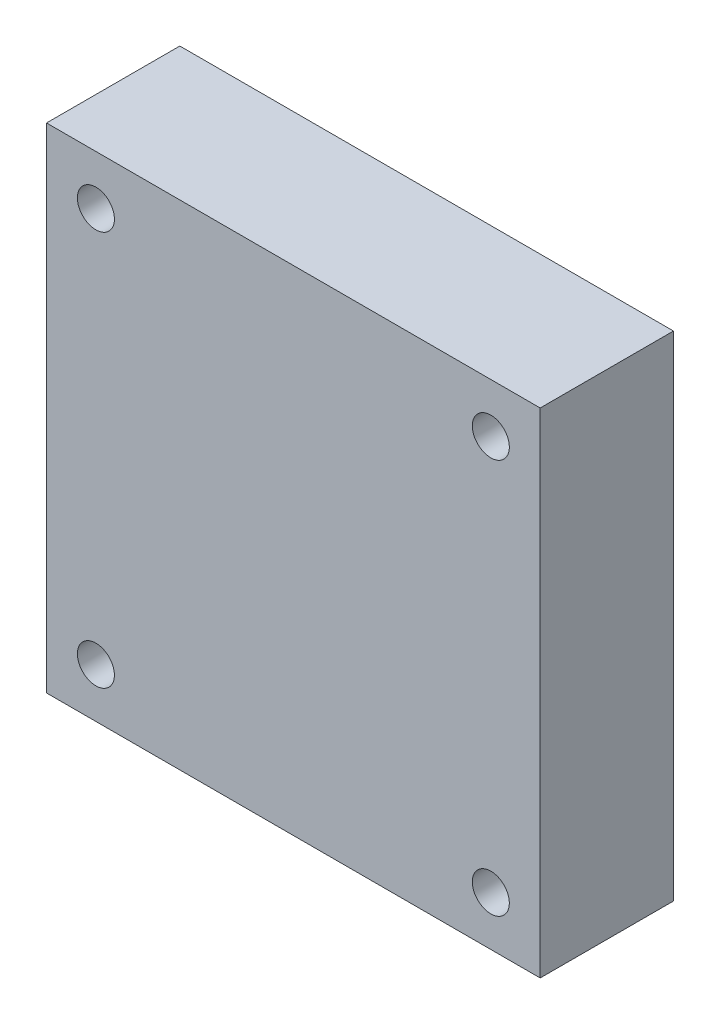
ISO-10303-21;
HEADER;
FILE_DESCRIPTION(('STEP AP214'),'2;1');
FILE_NAME('part.step','',(''),(''),'','','');
FILE_SCHEMA(('AUTOMOTIVE_DESIGN { 1 0 10303 214 1 1 1 1 }'));
ENDSEC;
DATA;
#1=APPLICATION_CONTEXT('core data for automotive mechanical design processes');
#2=APPLICATION_PROTOCOL_DEFINITION('international standard','automotive_design',2000,#1);
#3=PRODUCT_CONTEXT('',#1,'mechanical');
#4=PRODUCT('Part','Part','',(#3));
#5=PRODUCT_RELATED_PRODUCT_CATEGORY('part','',(#4));
#6=PRODUCT_DEFINITION_FORMATION('','',#4);
#7=PRODUCT_DEFINITION_CONTEXT('part definition',#1,'design');
#8=PRODUCT_DEFINITION('design','',#6,#7);
#9=PRODUCT_DEFINITION_SHAPE('','',#8);
#10=(LENGTH_UNIT() NAMED_UNIT(*) SI_UNIT(.MILLI.,.METRE.));
#11=(NAMED_UNIT(*) PLANE_ANGLE_UNIT() SI_UNIT($,.RADIAN.));
#12=(NAMED_UNIT(*) SI_UNIT($,.STERADIAN.) SOLID_ANGLE_UNIT());
#13=UNCERTAINTY_MEASURE_WITH_UNIT(LENGTH_MEASURE(1.E-05),#10,'distance_accuracy_value','');
#14=(GEOMETRIC_REPRESENTATION_CONTEXT(3) GLOBAL_UNCERTAINTY_ASSIGNED_CONTEXT((#13)) GLOBAL_UNIT_ASSIGNED_CONTEXT((#10,
#11,#12)) REPRESENTATION_CONTEXT('',''));
#15=CARTESIAN_POINT('',(0.,0.,0.));
#16=DIRECTION('',(0.,0.,1.));
#17=DIRECTION('',(1.,0.,0.));
#18=AXIS2_PLACEMENT_3D('',#15,#16,#17);
#19=CARTESIAN_POINT('',(0.,0.,-24.9999999999825));
#20=DIRECTION('',(0.,0.,-1.));
#21=DIRECTION('',(-1.,0.,0.));
#22=AXIS2_PLACEMENT_3D('',#19,#20,#21);
#23=PLANE('',#22);
#24=CARTESIAN_POINT('',(-43.5,-43.5,-24.9999999999825));
#25=DIRECTION('',(0.,0.,-1.));
#26=DIRECTION('',(-1.,0.,0.));
#27=AXIS2_PLACEMENT_3D('',#24,#25,#26);
#28=CIRCLE('',#27,1.5);
#29=CARTESIAN_POINT('',(-45.,-43.5,-24.9999999999825));
#30=VERTEX_POINT('',#29);
#31=EDGE_CURVE('E111',#30,#30,#28,.T.);
#32=ORIENTED_EDGE('',*,*,#31,.F.);
#33=EDGE_LOOP('',(#32));
#34=FACE_BOUND('',#33,.T.);
#35=CARTESIAN_POINT('',(-11.5,-11.5,-24.9999999999825));
#36=DIRECTION('',(0.,0.,-1.));
#37=DIRECTION('',(-1.,0.,0.));
#38=AXIS2_PLACEMENT_3D('',#35,#36,#37);
#39=CIRCLE('',#38,1.5);
#40=CARTESIAN_POINT('',(-13.,-11.5,-24.9999999999825));
#41=VERTEX_POINT('',#40);
#42=EDGE_CURVE('E284',#41,#41,#39,.T.);
#43=ORIENTED_EDGE('',*,*,#42,.F.);
#44=EDGE_LOOP('',(#43));
#45=FACE_BOUND('',#44,.T.);
#46=CARTESIAN_POINT('',(-11.5,-43.5,-24.9999999999825));
#47=DIRECTION('',(0.,0.,-1.));
#48=DIRECTION('',(-1.,0.,0.));
#49=AXIS2_PLACEMENT_3D('',#46,#47,#48);
#50=CIRCLE('',#49,1.5);
#51=CARTESIAN_POINT('',(-13.,-43.5,-24.9999999999825));
#52=VERTEX_POINT('',#51);
#53=EDGE_CURVE('E288',#52,#52,#50,.T.);
#54=ORIENTED_EDGE('',*,*,#53,.F.);
#55=EDGE_LOOP('',(#54));
#56=FACE_BOUND('',#55,.T.);
#57=CARTESIAN_POINT('',(-43.5,-11.5,-24.9999999999825));
#58=DIRECTION('',(0.,0.,-1.));
#59=DIRECTION('',(-1.,0.,0.));
#60=AXIS2_PLACEMENT_3D('',#57,#58,#59);
#61=CIRCLE('',#60,1.5);
#62=CARTESIAN_POINT('',(-45.,-11.5,-24.9999999999825));
#63=VERTEX_POINT('',#62);
#64=EDGE_CURVE('E291',#63,#63,#61,.T.);
#65=ORIENTED_EDGE('',*,*,#64,.F.);
#66=EDGE_LOOP('',(#65));
#67=FACE_BOUND('',#66,.T.);
#68=DIRECTION('',(1.,0.,0.));
#69=VECTOR('',#68,1.);
#70=CARTESIAN_POINT('',(-47.5,-7.50000000000001,-24.9999999999825));
#71=LINE('',#70,#69);
#72=CARTESIAN_POINT('',(-47.5,-7.50000000000001,-24.9999999999825));
#73=VERTEX_POINT('',#72);
#74=CARTESIAN_POINT('',(-7.5,-7.50000000000001,-24.9999999999825));
#75=VERTEX_POINT('',#74);
#76=EDGE_CURVE('E119',#73,#75,#71,.T.);
#77=ORIENTED_EDGE('',*,*,#76,.T.);
#78=DIRECTION('',(0.,-1.,0.));
#79=VECTOR('',#78,1.);
#80=CARTESIAN_POINT('',(-7.5,-7.50000000000001,-24.9999999999825));
#81=LINE('',#80,#79);
#82=CARTESIAN_POINT('',(-7.5,-47.5,-24.9999999999825));
#83=VERTEX_POINT('',#82);
#84=EDGE_CURVE('E117',#75,#83,#81,.T.);
#85=ORIENTED_EDGE('',*,*,#84,.T.);
#86=DIRECTION('',(1.,0.,0.));
#87=VECTOR('',#86,1.);
#88=CARTESIAN_POINT('',(-47.5,-47.5,-24.9999999999825));
#89=LINE('',#88,#87);
#90=CARTESIAN_POINT('',(-47.5,-47.5,-24.9999999999825));
#91=VERTEX_POINT('',#90);
#92=EDGE_CURVE('E51',#91,#83,#89,.T.);
#93=ORIENTED_EDGE('',*,*,#92,.F.);
#94=DIRECTION('',(0.,-1.,0.));
#95=VECTOR('',#94,1.);
#96=CARTESIAN_POINT('',(-47.5,-7.50000000000001,-24.9999999999825));
#97=LINE('',#96,#95);
#98=EDGE_CURVE('E12',#73,#91,#97,.T.);
#99=ORIENTED_EDGE('',*,*,#98,.F.);
#100=EDGE_LOOP('',(#77,#85,#93,#99));
#101=FACE_BOUND('',#100,.T.);
#102=ADVANCED_FACE('F41',(#34,#45,#56,#67,#101),#23,.T.);
#103=CARTESIAN_POINT('',(0.,0.,-14.1999999999825));
#104=DIRECTION('',(0.,0.,1.));
#105=DIRECTION('',(1.,0.,0.));
#106=AXIS2_PLACEMENT_3D('',#103,#104,#105);
#107=PLANE('',#106);
#108=CARTESIAN_POINT('',(-43.5,-43.5,-14.1999999999825));
#109=DIRECTION('',(0.,0.,1.));
#110=DIRECTION('',(-1.,0.,0.));
#111=AXIS2_PLACEMENT_3D('',#108,#109,#110);
#112=CIRCLE('',#111,1.5);
#113=CARTESIAN_POINT('',(-45.,-43.5,-14.1999999999825));
#114=VERTEX_POINT('',#113);
#115=EDGE_CURVE('E296',#114,#114,#112,.T.);
#116=ORIENTED_EDGE('',*,*,#115,.F.);
#117=EDGE_LOOP('',(#116));
#118=FACE_BOUND('',#117,.T.);
#119=CARTESIAN_POINT('',(-11.5,-11.5,-14.1999999999825));
#120=DIRECTION('',(0.,0.,1.));
#121=DIRECTION('',(-1.,0.,0.));
#122=AXIS2_PLACEMENT_3D('',#119,#120,#121);
#123=CIRCLE('',#122,1.5);
#124=CARTESIAN_POINT('',(-13.,-11.5,-14.1999999999825));
#125=VERTEX_POINT('',#124);
#126=EDGE_CURVE('E309',#125,#125,#123,.T.);
#127=ORIENTED_EDGE('',*,*,#126,.F.);
#128=EDGE_LOOP('',(#127));
#129=FACE_BOUND('',#128,.T.);
#130=CARTESIAN_POINT('',(-11.5,-43.5,-14.1999999999825));
#131=DIRECTION('',(0.,0.,1.));
#132=DIRECTION('',(1.,0.,0.));
#133=AXIS2_PLACEMENT_3D('',#130,#131,#132);
#134=CIRCLE('',#133,1.5);
#135=CARTESIAN_POINT('',(-9.99999999999998,-43.5,-14.1999999999825));
#136=VERTEX_POINT('',#135);
#137=EDGE_CURVE('E312',#136,#136,#134,.T.);
#138=ORIENTED_EDGE('',*,*,#137,.F.);
#139=EDGE_LOOP('',(#138));
#140=FACE_BOUND('',#139,.T.);
#141=CARTESIAN_POINT('',(-43.5,-11.5,-14.1999999999825));
#142=DIRECTION('',(0.,0.,1.));
#143=DIRECTION('',(1.,0.,0.));
#144=AXIS2_PLACEMENT_3D('',#141,#142,#143);
#145=CIRCLE('',#144,1.5);
#146=CARTESIAN_POINT('',(-42.,-11.5,-14.1999999999825));
#147=VERTEX_POINT('',#146);
#148=EDGE_CURVE('E292',#147,#147,#145,.T.);
#149=ORIENTED_EDGE('',*,*,#148,.F.);
#150=EDGE_LOOP('',(#149));
#151=FACE_BOUND('',#150,.T.);
#152=DIRECTION('',(-1.,0.,0.));
#153=VECTOR('',#152,1.);
#154=CARTESIAN_POINT('',(-7.49999999999999,-7.50000000000001,-14.1999999999825));
#155=LINE('',#154,#153);
#156=CARTESIAN_POINT('',(-7.49999999999999,-7.50000000000001,-14.1999999999825));
#157=VERTEX_POINT('',#156);
#158=CARTESIAN_POINT('',(-47.5,-7.50000000000001,-14.1999999999825));
#159=VERTEX_POINT('',#158);
#160=EDGE_CURVE('E91',#157,#159,#155,.T.);
#161=ORIENTED_EDGE('',*,*,#160,.T.);
#162=DIRECTION('',(0.,-1.,0.));
#163=VECTOR('',#162,1.);
#164=CARTESIAN_POINT('',(-47.5,-7.50000000000001,-14.1999999999825));
#165=LINE('',#164,#163);
#166=CARTESIAN_POINT('',(-47.5,-47.5,-14.1999999999825));
#167=VERTEX_POINT('',#166);
#168=EDGE_CURVE('E110',#159,#167,#165,.T.);
#169=ORIENTED_EDGE('',*,*,#168,.T.);
#170=DIRECTION('',(-1.,0.,0.));
#171=VECTOR('',#170,1.);
#172=CARTESIAN_POINT('',(-7.49999999999999,-47.5,-14.1999999999825));
#173=LINE('',#172,#171);
#174=CARTESIAN_POINT('',(-7.49999999999999,-47.5,-14.1999999999825));
#175=VERTEX_POINT('',#174);
#176=EDGE_CURVE('E93',#175,#167,#173,.T.);
#177=ORIENTED_EDGE('',*,*,#176,.F.);
#178=DIRECTION('',(0.,-1.,0.));
#179=VECTOR('',#178,1.);
#180=CARTESIAN_POINT('',(-7.49999999999999,-7.50000000000001,-14.1999999999825));
#181=LINE('',#180,#179);
#182=EDGE_CURVE('E86',#157,#175,#181,.T.);
#183=ORIENTED_EDGE('',*,*,#182,.F.);
#184=EDGE_LOOP('',(#161,#169,#177,#183));
#185=FACE_BOUND('',#184,.T.);
#186=ADVANCED_FACE('F89',(#118,#129,#140,#151,#185),#107,.T.);
#187=CARTESIAN_POINT('',(0.,-47.5,0.));
#188=DIRECTION('',(0.,-1.,0.));
#189=DIRECTION('',(0.,0.,-1.));
#190=AXIS2_PLACEMENT_3D('',#187,#188,#189);
#191=PLANE('',#190);
#192=DIRECTION('',(0.,0.,-1.));
#193=VECTOR('',#192,1.);
#194=CARTESIAN_POINT('',(-47.5,-47.5,-14.1999999999825));
#195=LINE('',#194,#193);
#196=EDGE_CURVE('E66',#167,#91,#195,.T.);
#197=ORIENTED_EDGE('',*,*,#196,.T.);
#198=ORIENTED_EDGE('',*,*,#92,.T.);
#199=DIRECTION('',(0.,0.,-1.));
#200=VECTOR('',#199,1.);
#201=CARTESIAN_POINT('',(-7.49999999999999,-47.5,-14.1999999999825));
#202=LINE('',#201,#200);
#203=EDGE_CURVE('E122',#175,#83,#202,.T.);
#204=ORIENTED_EDGE('',*,*,#203,.F.);
#205=ORIENTED_EDGE('',*,*,#176,.T.);
#206=EDGE_LOOP('',(#197,#198,#204,#205));
#207=FACE_BOUND('',#206,.T.);
#208=ADVANCED_FACE('F140',(#207),#191,.T.);
#209=CARTESIAN_POINT('',(-7.49999999999998,0.,0.));
#210=DIRECTION('',(-1.,0.,0.));
#211=DIRECTION('',(0.,0.,1.));
#212=AXIS2_PLACEMENT_3D('',#209,#210,#211);
#213=PLANE('',#212);
#214=ORIENTED_EDGE('',*,*,#203,.T.);
#215=ORIENTED_EDGE('',*,*,#84,.F.);
#216=DIRECTION('',(0.,0.,-1.));
#217=VECTOR('',#216,1.);
#218=CARTESIAN_POINT('',(-7.49999999999999,-7.50000000000001,-14.1999999999825));
#219=LINE('',#218,#217);
#220=EDGE_CURVE('E107',#157,#75,#219,.T.);
#221=ORIENTED_EDGE('',*,*,#220,.F.);
#222=ORIENTED_EDGE('',*,*,#182,.T.);
#223=EDGE_LOOP('',(#214,#215,#221,#222));
#224=FACE_BOUND('',#223,.T.);
#225=ADVANCED_FACE('F115',(#224),#213,.F.);
#226=CARTESIAN_POINT('',(-47.5,0.,0.));
#227=DIRECTION('',(-1.,0.,0.));
#228=DIRECTION('',(0.,0.,1.));
#229=AXIS2_PLACEMENT_3D('',#226,#227,#228);
#230=PLANE('',#229);
#231=DIRECTION('',(0.,0.,-1.));
#232=VECTOR('',#231,1.);
#233=CARTESIAN_POINT('',(-47.5,-7.50000000000001,-14.1999999999825));
#234=LINE('',#233,#232);
#235=EDGE_CURVE('E109',#159,#73,#234,.T.);
#236=ORIENTED_EDGE('',*,*,#235,.T.);
#237=ORIENTED_EDGE('',*,*,#98,.T.);
#238=ORIENTED_EDGE('',*,*,#196,.F.);
#239=ORIENTED_EDGE('',*,*,#168,.F.);
#240=EDGE_LOOP('',(#236,#237,#238,#239));
#241=FACE_BOUND('',#240,.T.);
#242=ADVANCED_FACE('F220',(#241),#230,.T.);
#243=CARTESIAN_POINT('',(0.,-7.5,0.));
#244=DIRECTION('',(0.,-1.,0.));
#245=DIRECTION('',(0.,0.,-1.));
#246=AXIS2_PLACEMENT_3D('',#243,#244,#245);
#247=PLANE('',#246);
#248=ORIENTED_EDGE('',*,*,#220,.T.);
#249=ORIENTED_EDGE('',*,*,#76,.F.);
#250=ORIENTED_EDGE('',*,*,#235,.F.);
#251=ORIENTED_EDGE('',*,*,#160,.F.);
#252=EDGE_LOOP('',(#248,#249,#250,#251));
#253=FACE_BOUND('',#252,.T.);
#254=ADVANCED_FACE('F106',(#253),#247,.F.);
#255=CARTESIAN_POINT('',(-43.5,-11.5,-39.1999999999825));
#256=DIRECTION('',(0.,0.,1.));
#257=DIRECTION('',(1.,0.,0.));
#258=AXIS2_PLACEMENT_3D('',#255,#256,#257);
#259=CYLINDRICAL_SURFACE('',#258,1.5);
#260=ORIENTED_EDGE('',*,*,#64,.T.);
#261=EDGE_LOOP('',(#260));
#262=FACE_BOUND('',#261,.T.);
#263=ORIENTED_EDGE('',*,*,#148,.T.);
#264=EDGE_LOOP('',(#263));
#265=FACE_BOUND('',#264,.T.);
#266=ADVANCED_FACE('F251',(#262,#265),#259,.F.);
#267=CARTESIAN_POINT('',(-11.5,-43.5,-39.1999999999825));
#268=DIRECTION('',(0.,0.,1.));
#269=DIRECTION('',(1.,0.,0.));
#270=AXIS2_PLACEMENT_3D('',#267,#268,#269);
#271=CYLINDRICAL_SURFACE('',#270,1.5);
#272=ORIENTED_EDGE('',*,*,#53,.T.);
#273=EDGE_LOOP('',(#272));
#274=FACE_BOUND('',#273,.T.);
#275=ORIENTED_EDGE('',*,*,#137,.T.);
#276=EDGE_LOOP('',(#275));
#277=FACE_BOUND('',#276,.T.);
#278=ADVANCED_FACE('F270',(#274,#277),#271,.F.);
#279=CARTESIAN_POINT('',(-11.5,-11.5,-39.1999999999825));
#280=DIRECTION('',(0.,0.,1.));
#281=DIRECTION('',(1.,0.,0.));
#282=AXIS2_PLACEMENT_3D('',#279,#280,#281);
#283=CYLINDRICAL_SURFACE('',#282,1.5);
#284=ORIENTED_EDGE('',*,*,#42,.T.);
#285=EDGE_LOOP('',(#284));
#286=FACE_BOUND('',#285,.T.);
#287=ORIENTED_EDGE('',*,*,#126,.T.);
#288=EDGE_LOOP('',(#287));
#289=FACE_BOUND('',#288,.T.);
#290=ADVANCED_FACE('F305',(#286,#289),#283,.F.);
#291=CARTESIAN_POINT('',(-43.5,-43.5,-39.1999999999825));
#292=DIRECTION('',(0.,0.,1.));
#293=DIRECTION('',(1.,0.,0.));
#294=AXIS2_PLACEMENT_3D('',#291,#292,#293);
#295=CYLINDRICAL_SURFACE('',#294,1.5);
#296=ORIENTED_EDGE('',*,*,#31,.T.);
#297=EDGE_LOOP('',(#296));
#298=FACE_BOUND('',#297,.T.);
#299=ORIENTED_EDGE('',*,*,#115,.T.);
#300=EDGE_LOOP('',(#299));
#301=FACE_BOUND('',#300,.T.);
#302=ADVANCED_FACE('F302',(#298,#301),#295,.F.);
#303=CLOSED_SHELL('',(#102,#186,#208,#225,#242,#254,#266,#278,#290,#302));
#304=MANIFOLD_SOLID_BREP('B2',#303);
#305=ADVANCED_BREP_SHAPE_REPRESENTATION('',(#18,#304),#14);
#306=SHAPE_DEFINITION_REPRESENTATION(#9,#305);
ENDSEC;
END-ISO-10303-21;
